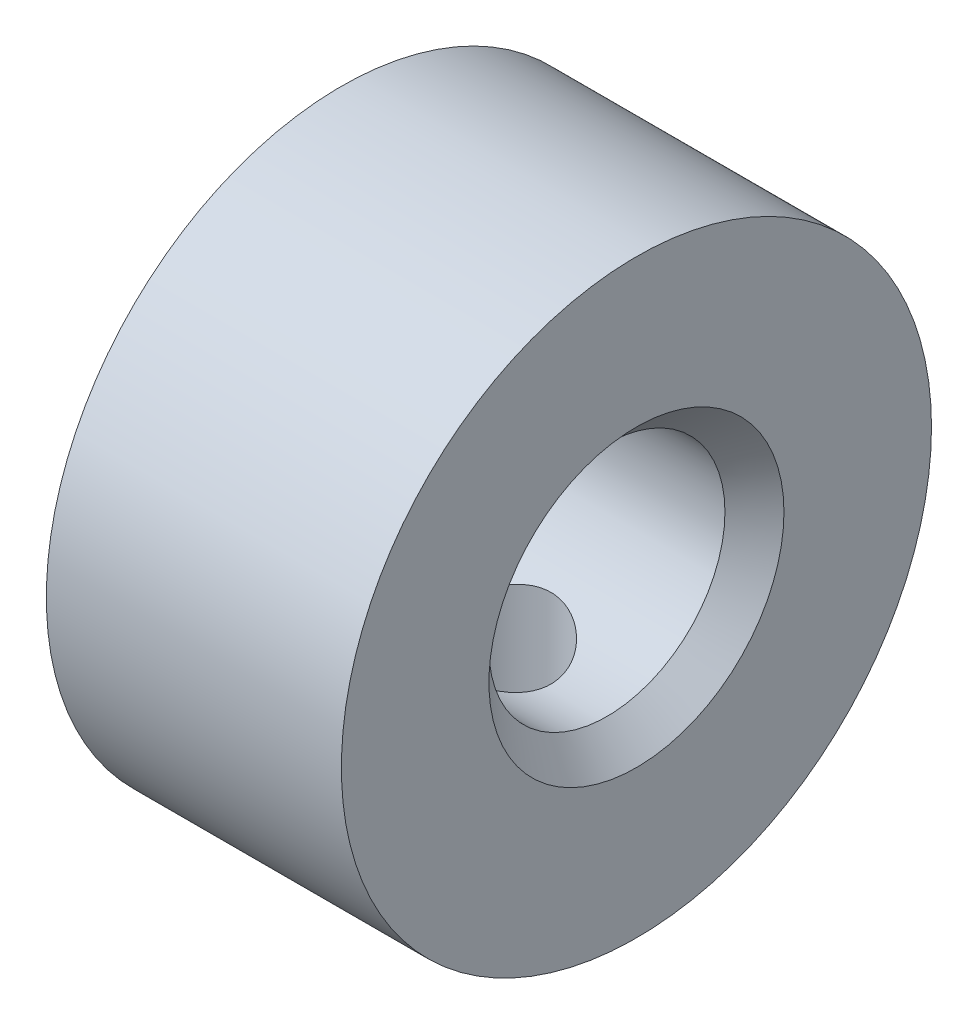
ISO-10303-21;
HEADER;
FILE_DESCRIPTION(('STEP AP214'),'2;1');
FILE_NAME('part.step','',(''),(''),'','','');
FILE_SCHEMA(('AUTOMOTIVE_DESIGN { 1 0 10303 214 1 1 1 1 }'));
ENDSEC;
DATA;
#1=APPLICATION_CONTEXT('core data for automotive mechanical design processes');
#2=APPLICATION_PROTOCOL_DEFINITION('international standard','automotive_design',2000,#1);
#3=PRODUCT_CONTEXT('',#1,'mechanical');
#4=PRODUCT('Part','Part','',(#3));
#5=PRODUCT_RELATED_PRODUCT_CATEGORY('part','',(#4));
#6=PRODUCT_DEFINITION_FORMATION('','',#4);
#7=PRODUCT_DEFINITION_CONTEXT('part definition',#1,'design');
#8=PRODUCT_DEFINITION('design','',#6,#7);
#9=PRODUCT_DEFINITION_SHAPE('','',#8);
#10=(LENGTH_UNIT() NAMED_UNIT(*) SI_UNIT(.MILLI.,.METRE.));
#11=(NAMED_UNIT(*) PLANE_ANGLE_UNIT() SI_UNIT($,.RADIAN.));
#12=(NAMED_UNIT(*) SI_UNIT($,.STERADIAN.) SOLID_ANGLE_UNIT());
#13=UNCERTAINTY_MEASURE_WITH_UNIT(LENGTH_MEASURE(1.E-05),#10,'distance_accuracy_value','');
#14=(GEOMETRIC_REPRESENTATION_CONTEXT(3) GLOBAL_UNCERTAINTY_ASSIGNED_CONTEXT((#13)) GLOBAL_UNIT_ASSIGNED_CONTEXT((#10,
#11,#12)) REPRESENTATION_CONTEXT('',''));
#15=CARTESIAN_POINT('',(0.,0.,0.));
#16=DIRECTION('',(0.,0.,1.));
#17=DIRECTION('',(1.,0.,0.));
#18=AXIS2_PLACEMENT_3D('',#15,#16,#17);
#19=CARTESIAN_POINT('',(0.,0.,0.));
#20=DIRECTION('',(1.,0.,0.));
#21=DIRECTION('',(0.,0.,-1.));
#22=AXIS2_PLACEMENT_3D('',#19,#20,#21);
#23=CYLINDRICAL_SURFACE('',#22,10.);
#24=CARTESIAN_POINT('',(7.09999978873321,-10.,0.));
#25=CARTESIAN_POINT('',(7.09994335812563,-9.99999784211661,0.11658687119405));
#26=CARTESIAN_POINT('',(7.09015345130723,-9.99794030822579,0.233220414522977));
#27=CARTESIAN_POINT('',(7.05139311886433,-9.98993190247435,0.463173536340058));
#28=CARTESIAN_POINT('',(7.02240825353874,-9.98397809962569,0.576490552857746));
#29=CARTESIAN_POINT('',(6.94619953492467,-9.96884186243514,0.796453569490859));
#30=CARTESIAN_POINT('',(6.89899398693072,-9.95966266928853,0.903106140450259));
#31=CARTESIAN_POINT('',(6.78774002055106,-9.93907058135645,1.10697222093644));
#32=CARTESIAN_POINT('',(6.72369230728883,-9.92765778008957,1.20418612539445));
#33=CARTESIAN_POINT('',(6.57956425377336,-9.90366273893078,1.38786485688206));
#34=CARTESIAN_POINT('',(6.49928183865842,-9.89106695402452,1.47416936648461));
#35=CARTESIAN_POINT('',(6.32539817893832,-9.86622347859508,1.63219100704577));
#36=CARTESIAN_POINT('',(6.23179582256771,-9.85397581723093,1.70390691913383));
#37=CARTESIAN_POINT('',(6.03276209418845,-9.83108314186671,1.83140841358035));
#38=CARTESIAN_POINT('',(5.92722090975797,-9.82045554309507,1.88702598014668));
#39=CARTESIAN_POINT('',(5.70803085641641,-9.80220027304822,1.97967529350166));
#40=CARTESIAN_POINT('',(5.59438287807941,-9.79457227284905,2.01670907823645));
#41=CARTESIAN_POINT('',(5.36393810343034,-9.7833178151591,2.07061518598533));
#42=CARTESIAN_POINT('',(5.24721022314695,-9.77963531307025,2.08777017555103));
#43=CARTESIAN_POINT('',(5.01247956272278,-9.77652050086186,2.10230975595816));
#44=CARTESIAN_POINT('',(4.89447692780327,-9.77708771160483,2.09969657557842));
#45=CARTESIAN_POINT('',(4.66262614271223,-9.78235726230034,2.07500252929936));
#46=CARTESIAN_POINT('',(4.54874152714733,-9.78699047878788,2.05324707236379));
#47=CARTESIAN_POINT('',(4.32627523386304,-9.79976092917792,1.99139992171527));
#48=CARTESIAN_POINT('',(4.21769383392408,-9.80789834641044,1.95130726864448));
#49=CARTESIAN_POINT('',(4.00798540328518,-9.82682990513796,1.85361670334925));
#50=CARTESIAN_POINT('',(3.9069196711581,-9.83764331404221,1.79589109257434));
#51=CARTESIAN_POINT('',(3.7157877094582,-9.86069577328683,1.66466337223329));
#52=CARTESIAN_POINT('',(3.62572286876303,-9.87293500325875,1.59115927383498));
#53=CARTESIAN_POINT('',(3.45727291085874,-9.89775776673579,1.42872638544723));
#54=CARTESIAN_POINT('',(3.37915529712331,-9.91034331052325,1.33952023546997));
#55=CARTESIAN_POINT('',(3.23894823061242,-9.93421776594581,1.1491331525184));
#56=CARTESIAN_POINT('',(3.17685901992444,-9.9455066579953,1.04795203871203));
#57=CARTESIAN_POINT('',(3.07041625783197,-9.96554669374358,0.836180230940706));
#58=CARTESIAN_POINT('',(3.02609475571385,-9.97429324384053,0.725572965873784));
#59=CARTESIAN_POINT('',(2.95673895281338,-9.98822763521437,0.498257152945007));
#60=CARTESIAN_POINT('',(2.93170207025546,-9.99341595284812,0.381549424032462));
#61=CARTESIAN_POINT('',(2.9020093395597,-9.99958177368703,0.147644883308854));
#62=CARTESIAN_POINT('',(2.89698736601269,-10.0006349148033,0.0304964826646753));
#63=CARTESIAN_POINT('',(2.90647823089432,-9.99862143890133,-0.202964737771103));
#64=CARTESIAN_POINT('',(2.92098985893413,-9.99555507714586,-0.319277608886864));
#65=CARTESIAN_POINT('',(2.96883254028297,-9.98569365251412,-0.546574738388489));
#66=CARTESIAN_POINT('',(3.00197454129354,-9.97893606565222,-0.657600558314525));
#67=CARTESIAN_POINT('',(3.08592907522064,-9.9624464420893,-0.872518288040437));
#68=CARTESIAN_POINT('',(3.13674303414071,-9.95271416535929,-0.976409621326725));
#69=CARTESIAN_POINT('',(3.25537867641912,-9.93116574452779,-1.17564098367243));
#70=CARTESIAN_POINT('',(3.32341849887788,-9.91932349873898,-1.27084823416018));
#71=CARTESIAN_POINT('',(3.4742842427545,-9.89492552972663,-1.44862514224099));
#72=CARTESIAN_POINT('',(3.55711192345732,-9.88236972173315,-1.53119329400993));
#73=CARTESIAN_POINT('',(3.73687481771029,-9.85770119250997,-1.68277659156537));
#74=CARTESIAN_POINT('',(3.83402455149253,-9.84559952705764,-1.75153945700293));
#75=CARTESIAN_POINT('',(4.03871019927728,-9.8234525267241,-1.87177274538525));
#76=CARTESIAN_POINT('',(4.14624567355369,-9.81340710483888,-1.92324390003795));
#77=CARTESIAN_POINT('',(4.36808129725723,-9.79660100820824,-2.00709727129998));
#78=CARTESIAN_POINT('',(4.4823404297882,-9.78982234853028,-2.03958421961162));
#79=CARTESIAN_POINT('',(4.71485491374764,-9.78028134007997,-2.08486018674085));
#80=CARTESIAN_POINT('',(4.83310968019969,-9.77751840597437,-2.09765207633165));
#81=CARTESIAN_POINT('',(5.06771692437788,-9.7763560324819,-2.10306150028235));
#82=CARTESIAN_POINT('',(5.18405993640159,-9.77787011418014,-2.09607885759659));
#83=CARTESIAN_POINT('',(5.41387255382569,-9.78489696334055,-2.06302492888329));
#84=CARTESIAN_POINT('',(5.52734218712183,-9.79040969196707,-2.03695382824661));
#85=CARTESIAN_POINT('',(5.74790417766335,-9.80477266541896,-1.96664810755877));
#86=CARTESIAN_POINT('',(5.85501415258989,-9.81361313919982,-1.92246663037986));
#87=CARTESIAN_POINT('',(6.06036240481358,-9.83364061398024,-1.81724191053673));
#88=CARTESIAN_POINT('',(6.15859983994823,-9.8448278373941,-1.75619706946535));
#89=CARTESIAN_POINT('',(6.34539581156379,-9.86855041310022,-1.61763148862917));
#90=CARTESIAN_POINT('',(6.43373885344238,-9.88110707354392,-1.53982384058314));
#91=CARTESIAN_POINT('',(6.59624586436447,-9.90600603045962,-1.37052923123717));
#92=CARTESIAN_POINT('',(6.670406563844,-9.91834827690633,-1.27903912425743));
#93=CARTESIAN_POINT('',(6.80327209863639,-9.9415999512401,-1.08368334279104));
#94=CARTESIAN_POINT('',(6.86178521142512,-9.95249085179797,-0.979684959692831));
#95=CARTESIAN_POINT('',(6.96040930199491,-9.97142963949248,-0.763126659526656));
#96=CARTESIAN_POINT('',(7.00053626986791,-9.97947999559182,-0.650574281425086));
#97=CARTESIAN_POINT('',(7.05380249584687,-9.99033385438673,-0.448198827640406));
#98=CARTESIAN_POINT('',(7.07112993805098,-9.99393691066209,-0.359497048600377));
#99=CARTESIAN_POINT('',(7.09425021475977,-9.99877077387033,-0.180539469660138));
#100=CARTESIAN_POINT('',(7.10004348804197,-10.0000016710437,-0.0902837290067712));
#101=CARTESIAN_POINT('',(7.09999978873321,-10.,0.));
#102=B_SPLINE_CURVE_WITH_KNOTS('',3,(#24,#25,#26,#27,#28,#29,#30,#31,#32,#33,#34,#35,#36,#37,
#38,#39,#40,#41,#42,#43,#44,#45,#46,#47,#48,#49,#50,#51,#52,#53,#54,#55,#56,#57,#58,#59,#60,#61,
#62,#63,#64,#65,#66,#67,#68,#69,#70,#71,#72,#73,#74,#75,#76,#77,#78,#79,#80,#81,#82,#83,#84,#85,
#86,#87,#88,#89,#90,#91,#92,#93,#94,#95,#96,#97,#98,#99,#100,#101),.UNSPECIFIED.,.T.,.F.,(4,2,2,
2,2,2,2,2,2,2,2,2,2,2,2,2,2,2,2,2,2,2,2,2,2,2,2,2,2,2,2,2,2,2,2,2,2,2,4),(0.,0.349430265994381,
0.699123695302866,1.0484667178877,1.39779511701071,1.75177373639281,2.10578191838845,
2.46336158466721,2.82090202924991,3.17329350142966,3.52564524353074,3.87212046267024,
4.21861381063097,4.56767848520377,4.91678718421937,5.27282965854694,5.62887751010266,
5.98556473966343,6.34220420854565,6.69228900929655,7.04235211823508,7.3889254614431,
7.7355267771899,8.08675836904006,8.43803177416036,8.79523422509233,9.15242155890823,
9.50761929744975,9.86276525707901,10.2107820593936,10.5587954817454,10.9057949260558,
11.2528272722728,11.6063529317332,11.9599599941794,12.3177194169753,12.6751671096617,
12.9457727732036,13.2163681422936),.UNSPECIFIED.);
#103=CARTESIAN_POINT('',(7.09999978873321,-10.,0.));
#104=VERTEX_POINT('',#103);
#105=EDGE_CURVE('E50',#104,#104,#102,.T.);
#106=ORIENTED_EDGE('',*,*,#105,.F.);
#107=EDGE_LOOP('',(#106));
#108=FACE_BOUND('',#107,.T.);
#109=CARTESIAN_POINT('',(0.,0.,0.));
#110=DIRECTION('',(1.,0.,0.));
#111=DIRECTION('',(0.,0.,-1.));
#112=AXIS2_PLACEMENT_3D('',#109,#110,#111);
#113=CIRCLE('',#112,10.);
#114=CARTESIAN_POINT('',(0.,0.,-10.));
#115=VERTEX_POINT('',#114);
#116=EDGE_CURVE('E57',#115,#115,#113,.T.);
#117=ORIENTED_EDGE('',*,*,#116,.T.);
#118=EDGE_LOOP('',(#117));
#119=FACE_BOUND('',#118,.T.);
#120=CARTESIAN_POINT('',(10.,0.,0.));
#121=DIRECTION('',(1.,0.,0.));
#122=DIRECTION('',(0.,0.,-1.));
#123=AXIS2_PLACEMENT_3D('',#120,#121,#122);
#124=CIRCLE('',#123,10.);
#125=CARTESIAN_POINT('',(10.,0.,-10.));
#126=VERTEX_POINT('',#125);
#127=EDGE_CURVE('E76',#126,#126,#124,.T.);
#128=ORIENTED_EDGE('',*,*,#127,.F.);
#129=EDGE_LOOP('',(#128));
#130=FACE_BOUND('',#129,.T.);
#131=ADVANCED_FACE('F30',(#108,#119,#130),#23,.T.);
#132=CARTESIAN_POINT('',(0.,10.,0.));
#133=DIRECTION('',(-1.,0.,0.));
#134=DIRECTION('',(0.,0.,1.));
#135=AXIS2_PLACEMENT_3D('',#132,#133,#134);
#136=PLANE('',#135);
#137=CARTESIAN_POINT('',(0.,0.,0.));
#138=DIRECTION('',(-1.,0.,0.));
#139=DIRECTION('',(0.,0.,1.));
#140=AXIS2_PLACEMENT_3D('',#137,#138,#139);
#141=CIRCLE('',#140,5.00000000008289);
#142=CARTESIAN_POINT('',(0.,0.,5.00000000008289));
#143=VERTEX_POINT('',#142);
#144=EDGE_CURVE('E10',#143,#143,#141,.F.);
#145=ORIENTED_EDGE('',*,*,#144,.T.);
#146=EDGE_LOOP('',(#145));
#147=FACE_BOUND('',#146,.T.);
#148=ORIENTED_EDGE('',*,*,#116,.F.);
#149=EDGE_LOOP('',(#148));
#150=FACE_BOUND('',#149,.T.);
#151=ADVANCED_FACE('F85',(#147,#150),#136,.T.);
#152=CARTESIAN_POINT('',(10.,0.,0.));
#153=DIRECTION('',(1.,0.,0.));
#154=DIRECTION('',(0.,0.,-1.));
#155=AXIS2_PLACEMENT_3D('',#152,#153,#154);
#156=PLANE('',#155);
#157=CARTESIAN_POINT('',(10.,0.,0.));
#158=DIRECTION('',(1.,0.,0.));
#159=DIRECTION('',(0.,0.,-1.));
#160=AXIS2_PLACEMENT_3D('',#157,#158,#159);
#161=CIRCLE('',#160,5.00000000008293);
#162=CARTESIAN_POINT('',(10.,0.,-5.00000000008293));
#163=VERTEX_POINT('',#162);
#164=EDGE_CURVE('E45',#163,#163,#161,.F.);
#165=ORIENTED_EDGE('',*,*,#164,.T.);
#166=EDGE_LOOP('',(#165));
#167=FACE_BOUND('',#166,.T.);
#168=ORIENTED_EDGE('',*,*,#127,.T.);
#169=EDGE_LOOP('',(#168));
#170=FACE_BOUND('',#169,.T.);
#171=ADVANCED_FACE('F87',(#167,#170),#156,.T.);
#172=CARTESIAN_POINT('',(0.,0.,0.));
#173=DIRECTION('',(-1.,0.,0.));
#174=DIRECTION('',(0.,0.,1.));
#175=AXIS2_PLACEMENT_3D('',#172,#173,#174);
#176=CYLINDRICAL_SURFACE('',#175,3.99999999999999);
#177=CARTESIAN_POINT('',(8.9999999999171,0.,0.));
#178=DIRECTION('',(1.,0.,0.));
#179=DIRECTION('',(0.,0.,-1.));
#180=AXIS2_PLACEMENT_3D('',#177,#178,#179);
#181=CIRCLE('',#180,3.99999999999999);
#182=CARTESIAN_POINT('',(8.9999999999171,0.,-3.99999999999999));
#183=VERTEX_POINT('',#182);
#184=EDGE_CURVE('E37',#183,#183,#181,.T.);
#185=ORIENTED_EDGE('',*,*,#184,.T.);
#186=EDGE_LOOP('',(#185));
#187=FACE_BOUND('',#186,.T.);
#188=CARTESIAN_POINT('',(1.00000000008294,0.,0.));
#189=DIRECTION('',(-1.,0.,0.));
#190=DIRECTION('',(0.,0.,1.));
#191=AXIS2_PLACEMENT_3D('',#188,#189,#190);
#192=CIRCLE('',#191,3.99999999999999);
#193=CARTESIAN_POINT('',(1.00000000008294,0.,3.99999999999999));
#194=VERTEX_POINT('',#193);
#195=EDGE_CURVE('E41',#194,#194,#192,.T.);
#196=ORIENTED_EDGE('',*,*,#195,.T.);
#197=EDGE_LOOP('',(#196));
#198=FACE_BOUND('',#197,.T.);
#199=CARTESIAN_POINT('',(5.,-3.40498978202283,2.09905802309513));
#200=CARTESIAN_POINT('',(4.89144184093258,-3.40500191562609,2.09904852968439));
#201=CARTESIAN_POINT('',(4.7827618970044,-3.41026019989266,2.09058212902854));
#202=CARTESIAN_POINT('',(4.56881092914406,-3.43050652957845,2.05717756147529));
#203=CARTESIAN_POINT('',(4.46354673868096,-3.44551295155027,2.03220828287643));
#204=CARTESIAN_POINT('',(4.25993237282517,-3.48302069436574,1.96721939203471));
#205=CARTESIAN_POINT('',(4.16154623695593,-3.50547884613397,1.92728629911618));
#206=CARTESIAN_POINT('',(3.97289900144768,-3.55529090068847,1.8337681514601));
#207=CARTESIAN_POINT('',(3.88263901421017,-3.58264547222658,1.78018123146225));
#208=CARTESIAN_POINT('',(3.70371324430877,-3.64221351653473,1.65514229927915));
#209=CARTESIAN_POINT('',(3.61594709618861,-3.67464257469405,1.58250512707343));
#210=CARTESIAN_POINT('',(3.45313223009199,-3.73896837678904,1.42388351508184));
#211=CARTESIAN_POINT('',(3.37809043265446,-3.77086482259934,1.33789186043793));
#212=CARTESIAN_POINT('',(3.23725124120004,-3.83342715947682,1.14702167486599));
#213=CARTESIAN_POINT('',(3.17259120921114,-3.86381489827444,1.04120405051593));
#214=CARTESIAN_POINT('',(3.06240582748122,-3.91707562273466,0.818296622199438));
#215=CARTESIAN_POINT('',(3.01686717563369,-3.93995383010134,0.701214724337852));
#216=CARTESIAN_POINT('',(2.94988951378837,-3.9740500494895,0.468670403787382));
#217=CARTESIAN_POINT('',(2.92686217974224,-3.98603151374362,0.353780009463659));
#218=CARTESIAN_POINT('',(2.9002961738638,-3.99985607768416,0.121193065299986));
#219=CARTESIAN_POINT('',(2.89674430946608,-4.00170604038747,0.00349846929981093));
#220=CARTESIAN_POINT('',(2.90869204877623,-3.99539043137887,-0.219291881264317));
#221=CARTESIAN_POINT('',(2.92240358142741,-3.98816502313011,-0.324516856115344));
#222=CARTESIAN_POINT('',(2.965242320225,-3.96596827927621,-0.530914852781879));
#223=CARTESIAN_POINT('',(2.99437069774552,-3.95099635509161,-0.632087566077565));
#224=CARTESIAN_POINT('',(3.06732313408917,-3.91441864323163,-0.829161480401219));
#225=CARTESIAN_POINT('',(3.11132817779037,-3.8927314469809,-0.924979949514825));
#226=CARTESIAN_POINT('',(3.21249073930506,-3.84462278478114,-1.10808411777454));
#227=CARTESIAN_POINT('',(3.26965276276457,-3.81819969770008,-1.19536687921915));
#228=CARTESIAN_POINT('',(3.40213866589232,-3.75987936633249,-1.36837938106714));
#229=CARTESIAN_POINT('',(3.47871657364855,-3.72769872094347,-1.45305375722834));
#230=CARTESIAN_POINT('',(3.64454422925621,-3.6631127772206,-1.60895627514974));
#231=CARTESIAN_POINT('',(3.73380533323948,-3.63070730258583,-1.68017223206163));
#232=CARTESIAN_POINT('',(3.93060943372639,-3.56663650602157,-1.8124300335221));
#233=CARTESIAN_POINT('',(4.03902212782457,-3.53520972208644,-1.87230545380319));
#234=CARTESIAN_POINT('',(4.2663679816455,-3.48028876915573,-1.97253275484187));
#235=CARTESIAN_POINT('',(4.38528919488261,-3.4567857349141,-2.01290647652217));
#236=CARTESIAN_POINT('',(4.62022522658638,-3.42315043374889,-2.06955393939036));
#237=CARTESIAN_POINT('',(4.73569372673083,-3.41208846534454,-2.08751648949135));
#238=CARTESIAN_POINT('',(4.96849117788609,-3.40199379292187,-2.10393707001613));
#239=CARTESIAN_POINT('',(5.08581836998392,-3.40295032392593,-2.10241255499542));
#240=CARTESIAN_POINT('',(5.30309485429938,-3.41579557377579,-2.08145127862011));
#241=CARTESIAN_POINT('',(5.40336321425584,-3.42628448856393,-2.06430739224897));
#242=CARTESIAN_POINT('',(5.59936647591764,-3.45485609265378,-2.01612203411332));
#243=CARTESIAN_POINT('',(5.69509967438114,-3.47294161019478,-1.98507538602168));
#244=CARTESIAN_POINT('',(5.8842793167783,-3.51560275765046,-1.90854121847392));
#245=CARTESIAN_POINT('',(5.97742767558468,-3.54043440789797,-1.86246531960975));
#246=CARTESIAN_POINT('',(6.15522310655424,-3.59360810180515,-1.75767797440329));
#247=CARTESIAN_POINT('',(6.23986578663016,-3.62195194236151,-1.69896004875986));
#248=CARTESIAN_POINT('',(6.41082409027366,-3.68378310364565,-1.56084564309415));
#249=CARTESIAN_POINT('',(6.49567354592225,-3.71742966404406,-1.47969733646695));
#250=CARTESIAN_POINT('',(6.65107383760356,-3.78267262071716,-1.30390926831377));
#251=CARTESIAN_POINT('',(6.72161817062644,-3.81426808015823,-1.20926340404227));
#252=CARTESIAN_POINT('',(6.8487728335298,-3.87334206548729,-1.00448102079612));
#253=CARTESIAN_POINT('',(6.9047610108656,-3.90062163203307,-0.893896512788966));
#254=CARTESIAN_POINT('',(6.99675500144858,-3.946413756901,-0.663034988673064));
#255=CARTESIAN_POINT('',(7.0327800491886,-3.96493475158268,-0.542767430632495));
#256=CARTESIAN_POINT('',(7.08044053503727,-3.9896471813287,-0.308565808593944));
#257=CARTESIAN_POINT('',(7.09410689171895,-3.99686237114934,-0.195152993342512));
#258=CARTESIAN_POINT('',(7.10281757109742,-4.00148532651548,0.0325672443023281));
#259=CARTESIAN_POINT('',(7.09786990820634,-3.99889731290382,0.146874260540043));
#260=CARTESIAN_POINT('',(7.07074713542041,-3.9847918844437,0.363790529152527));
#261=CARTESIAN_POINT('',(7.04993239432187,-3.97397972191423,0.466621291890336));
#262=CARTESIAN_POINT('',(6.99362413759242,-3.94527686054255,0.667122587069092));
#263=CARTESIAN_POINT('',(6.95812870964539,-3.92738523953847,0.764792445377257));
#264=CARTESIAN_POINT('',(6.87208625411274,-3.88523494189212,0.956538626975583));
#265=CARTESIAN_POINT('',(6.82100453025443,-3.86075448638614,1.05032471754913));
#266=CARTESIAN_POINT('',(6.70589983121865,-3.80785971441554,1.22834951409965));
#267=CARTESIAN_POINT('',(6.64187114709162,-3.77944366430191,1.31258398263463));
#268=CARTESIAN_POINT('',(6.49472561558297,-3.71780342348303,1.47871812866515));
#269=CARTESIAN_POINT('',(6.41029538802581,-3.68439106963927,1.55938823551125));
#270=CARTESIAN_POINT('',(6.22888569125267,-3.61886736531523,1.70594731454246));
#271=CARTESIAN_POINT('',(6.13189325350008,-3.5867574049748,1.77182081665034));
#272=CARTESIAN_POINT('',(5.92202820866302,-3.5260745336614,1.88982272366121));
#273=CARTESIAN_POINT('',(5.80861668043757,-3.49774552716689,1.94113915248863));
#274=CARTESIAN_POINT('',(5.63197135222195,-3.46263180239891,2.00268119941677));
#275=CARTESIAN_POINT('',(5.57205683270508,-3.4521631333782,2.02061415399149));
#276=CARTESIAN_POINT('',(5.45046944254091,-3.43412073207203,2.05112927176571));
#277=CARTESIAN_POINT('',(5.38879778253357,-3.42654505602793,2.06371502830959));
#278=CARTESIAN_POINT('',(5.27271036568255,-3.41546828853132,2.08198824616277));
#279=CARTESIAN_POINT('',(5.21844390193073,-3.41155414778973,2.08837940815629));
#280=CARTESIAN_POINT('',(5.1094619656434,-3.40631176579224,2.09691680404468));
#281=CARTESIAN_POINT('',(5.05474646922622,-3.4049836629808,2.09906281067373));
#282=CARTESIAN_POINT('',(5.,-3.40498978202283,2.09905802309513));
#283=B_SPLINE_CURVE_WITH_KNOTS('',3,(#199,#200,#201,#202,#203,#204,#205,#206,#207,#208,#209,
#210,#211,#212,#213,#214,#215,#216,#217,#218,#219,#220,#221,#222,#223,#224,#225,#226,#227,#228,
#229,#230,#231,#232,#233,#234,#235,#236,#237,#238,#239,#240,#241,#242,#243,#244,#245,#246,#247,
#248,#249,#250,#251,#252,#253,#254,#255,#256,#257,#258,#259,#260,#261,#262,#263,#264,#265,#266,
#267,#268,#269,#270,#271,#272,#273,#274,#275,#276,#277,#278,#279,#280,#281,#282),.UNSPECIFIED.,
.T.,.F.,(4,2,2,2,2,2,2,2,2,2,2,2,2,2,2,2,2,2,2,2,2,2,2,2,2,2,2,2,2,2,2,2,2,2,2,2,2,2,2,2,2,4),
(0.,0.325451631360318,0.651518570329914,0.975728603904912,1.29998295184219,1.65387228197781,
2.00795347286472,2.38896790660264,2.76971684039356,3.12108902440962,3.47222316160042,
3.78980392643846,4.10740882457395,4.42902563889197,4.750752756124,5.10511052237226,
5.45978759239054,5.84111263013044,6.22200960705294,6.57201916074041,6.92171523301208,
7.2271254428801,7.53264945886243,7.85195904670626,8.17143267857887,8.53622856169538,
8.90118990856,9.27984536313848,9.65813534567939,9.99964232513682,10.3410022829166,
10.6559917470526,10.9710222548565,11.298381863534,11.6258861371339,11.9886794673195,
12.3518503560406,12.7324613885446,12.9224347934161,13.1122803324854,13.2763985719087,
13.440525597219),.UNSPECIFIED.);
#284=CARTESIAN_POINT('',(5.,-3.40498978202283,2.09905802309513));
#285=VERTEX_POINT('',#284);
#286=EDGE_CURVE('E72',#285,#285,#283,.T.);
#287=ORIENTED_EDGE('',*,*,#286,.T.);
#288=EDGE_LOOP('',(#287));
#289=FACE_BOUND('',#288,.T.);
#290=ADVANCED_FACE('F66',(#187,#198,#289),#176,.F.);
#291=CARTESIAN_POINT('',(5.,-3.40382767038507,-0.000941976904869));
#292=DIRECTION('',(0.,1.,0.));
#293=DIRECTION('',(0.,0.,1.));
#294=AXIS2_PLACEMENT_3D('',#291,#292,#293);
#295=CYLINDRICAL_SURFACE('',#294,2.1);
#296=ORIENTED_EDGE('',*,*,#105,.T.);
#297=EDGE_LOOP('',(#296));
#298=FACE_BOUND('',#297,.T.);
#299=ORIENTED_EDGE('',*,*,#286,.F.);
#300=EDGE_LOOP('',(#299));
#301=FACE_BOUND('',#300,.T.);
#302=ADVANCED_FACE('F61',(#298,#301),#295,.F.);
#303=CARTESIAN_POINT('',(10.,0.,0.));
#304=DIRECTION('',(1.,0.,0.));
#305=DIRECTION('',(0.,0.,-1.));
#306=AXIS2_PLACEMENT_3D('',#303,#304,#305);
#307=CONICAL_SURFACE('',#306,5.00000000008293,0.785398163397472);
#308=ORIENTED_EDGE('',*,*,#184,.F.);
#309=EDGE_LOOP('',(#308));
#310=FACE_BOUND('',#309,.T.);
#311=ORIENTED_EDGE('',*,*,#164,.F.);
#312=EDGE_LOOP('',(#311));
#313=FACE_BOUND('',#312,.T.);
#314=ADVANCED_FACE('F65',(#310,#313),#307,.F.);
#315=CARTESIAN_POINT('',(1.00000000008294,0.,0.));
#316=DIRECTION('',(-1.,0.,0.));
#317=DIRECTION('',(0.,0.,1.));
#318=AXIS2_PLACEMENT_3D('',#315,#316,#317);
#319=CONICAL_SURFACE('',#318,3.99999999999999,0.785398163397427);
#320=ORIENTED_EDGE('',*,*,#144,.F.);
#321=EDGE_LOOP('',(#320));
#322=FACE_BOUND('',#321,.T.);
#323=ORIENTED_EDGE('',*,*,#195,.F.);
#324=EDGE_LOOP('',(#323));
#325=FACE_BOUND('',#324,.T.);
#326=ADVANCED_FACE('F32',(#322,#325),#319,.F.);
#327=CLOSED_SHELL('',(#131,#151,#171,#290,#302,#314,#326));
#328=MANIFOLD_SOLID_BREP('B2',#327);
#329=ADVANCED_BREP_SHAPE_REPRESENTATION('',(#18,#328),#14);
#330=SHAPE_DEFINITION_REPRESENTATION(#9,#329);
ENDSEC;
END-ISO-10303-21;
